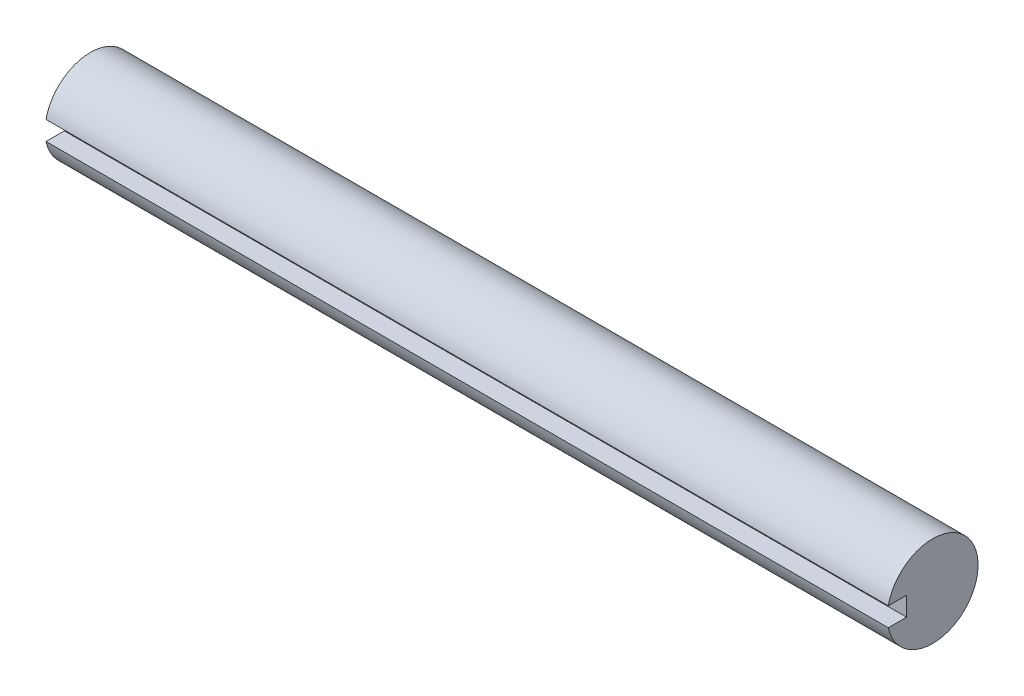
ISO-10303-21;
HEADER;
FILE_DESCRIPTION(('STEP AP214'),'2;1');
FILE_NAME('part.step','',(''),(''),'','','');
FILE_SCHEMA(('AUTOMOTIVE_DESIGN { 1 0 10303 214 1 1 1 1 }'));
ENDSEC;
DATA;
#1=APPLICATION_CONTEXT('core data for automotive mechanical design processes');
#2=APPLICATION_PROTOCOL_DEFINITION('international standard','automotive_design',2000,#1);
#3=PRODUCT_CONTEXT('',#1,'mechanical');
#4=PRODUCT('Part','Part','',(#3));
#5=PRODUCT_RELATED_PRODUCT_CATEGORY('part','',(#4));
#6=PRODUCT_DEFINITION_FORMATION('','',#4);
#7=PRODUCT_DEFINITION_CONTEXT('part definition',#1,'design');
#8=PRODUCT_DEFINITION('design','',#6,#7);
#9=PRODUCT_DEFINITION_SHAPE('','',#8);
#10=(LENGTH_UNIT() NAMED_UNIT(*) SI_UNIT(.MILLI.,.METRE.));
#11=(NAMED_UNIT(*) PLANE_ANGLE_UNIT() SI_UNIT($,.RADIAN.));
#12=(NAMED_UNIT(*) SI_UNIT($,.STERADIAN.) SOLID_ANGLE_UNIT());
#13=UNCERTAINTY_MEASURE_WITH_UNIT(LENGTH_MEASURE(1.E-05),#10,'distance_accuracy_value','');
#14=(GEOMETRIC_REPRESENTATION_CONTEXT(3) GLOBAL_UNCERTAINTY_ASSIGNED_CONTEXT((#13)) GLOBAL_UNIT_ASSIGNED_CONTEXT((#10,
#11,#12)) REPRESENTATION_CONTEXT('',''));
#15=CARTESIAN_POINT('',(0.,0.,0.));
#16=DIRECTION('',(0.,0.,1.));
#17=DIRECTION('',(1.,0.,0.));
#18=AXIS2_PLACEMENT_3D('',#15,#16,#17);
#19=CARTESIAN_POINT('',(230.,0.,0.));
#20=DIRECTION('',(-1.,0.,0.));
#21=DIRECTION('',(0.,0.,1.));
#22=AXIS2_PLACEMENT_3D('',#19,#20,#21);
#23=CYLINDRICAL_SURFACE('',#22,12.4);
#24=CARTESIAN_POINT('',(230.,0.,0.));
#25=DIRECTION('',(1.,0.,0.));
#26=DIRECTION('',(0.,0.,-1.));
#27=AXIS2_PLACEMENT_3D('',#24,#25,#26);
#28=CIRCLE('',#27,12.4);
#29=CARTESIAN_POINT('',(230.,-2.60000000000001,12.1243556529821));
#30=VERTEX_POINT('',#29);
#31=CARTESIAN_POINT('',(230.,2.59999999999999,12.1243556529821));
#32=VERTEX_POINT('',#31);
#33=EDGE_CURVE('E12',#30,#32,#28,.T.);
#34=ORIENTED_EDGE('',*,*,#33,.F.);
#35=DIRECTION('',(-1.,0.,0.));
#36=VECTOR('',#35,1.);
#37=CARTESIAN_POINT('',(230.,-2.60000000000001,12.1243556529821));
#38=LINE('',#37,#36);
#39=CARTESIAN_POINT('',(0.,-2.60000000000001,12.1243556529821));
#40=VERTEX_POINT('',#39);
#41=EDGE_CURVE('E94',#30,#40,#38,.T.);
#42=ORIENTED_EDGE('',*,*,#41,.T.);
#43=CARTESIAN_POINT('',(0.,0.,0.));
#44=DIRECTION('',(1.,0.,0.));
#45=DIRECTION('',(0.,0.,-1.));
#46=AXIS2_PLACEMENT_3D('',#43,#44,#45);
#47=CIRCLE('',#46,12.4);
#48=CARTESIAN_POINT('',(0.,2.59999999999999,12.1243556529821));
#49=VERTEX_POINT('',#48);
#50=EDGE_CURVE('E57',#40,#49,#47,.T.);
#51=ORIENTED_EDGE('',*,*,#50,.T.);
#52=DIRECTION('',(-1.,0.,0.));
#53=VECTOR('',#52,1.);
#54=CARTESIAN_POINT('',(230.,2.59999999999999,12.1243556529821));
#55=LINE('',#54,#53);
#56=EDGE_CURVE('E68',#32,#49,#55,.T.);
#57=ORIENTED_EDGE('',*,*,#56,.F.);
#58=EDGE_LOOP('',(#34,#42,#51,#57));
#59=FACE_BOUND('',#58,.T.);
#60=ADVANCED_FACE('F54',(#59),#23,.T.);
#61=CARTESIAN_POINT('',(230.,0.,0.));
#62=DIRECTION('',(1.,0.,0.));
#63=DIRECTION('',(0.,0.,-1.));
#64=AXIS2_PLACEMENT_3D('',#61,#62,#63);
#65=PLANE('',#64);
#66=DIRECTION('',(0.,0.,1.));
#67=VECTOR('',#66,1.);
#68=CARTESIAN_POINT('',(230.,-2.6,7.12435565298214));
#69=LINE('',#68,#67);
#70=CARTESIAN_POINT('',(230.,-2.6,7.12435565298214));
#71=VERTEX_POINT('',#70);
#72=EDGE_CURVE('E104',#71,#30,#69,.T.);
#73=ORIENTED_EDGE('',*,*,#72,.T.);
#74=ORIENTED_EDGE('',*,*,#33,.T.);
#75=DIRECTION('',(0.,0.,1.));
#76=VECTOR('',#75,1.);
#77=CARTESIAN_POINT('',(230.,2.6,7.12435565298214));
#78=LINE('',#77,#76);
#79=CARTESIAN_POINT('',(230.,2.6,7.12435565298214));
#80=VERTEX_POINT('',#79);
#81=EDGE_CURVE('E98',#80,#32,#78,.T.);
#82=ORIENTED_EDGE('',*,*,#81,.F.);
#83=DIRECTION('',(0.,1.,0.));
#84=VECTOR('',#83,1.);
#85=CARTESIAN_POINT('',(230.,-2.6,7.12435565298214));
#86=LINE('',#85,#84);
#87=EDGE_CURVE('E103',#71,#80,#86,.T.);
#88=ORIENTED_EDGE('',*,*,#87,.F.);
#89=EDGE_LOOP('',(#73,#74,#82,#88));
#90=FACE_BOUND('',#89,.T.);
#91=ADVANCED_FACE('F111',(#90),#65,.T.);
#92=CARTESIAN_POINT('',(0.,0.,0.));
#93=DIRECTION('',(1.,0.,0.));
#94=DIRECTION('',(0.,0.,-1.));
#95=AXIS2_PLACEMENT_3D('',#92,#93,#94);
#96=PLANE('',#95);
#97=ORIENTED_EDGE('',*,*,#50,.F.);
#98=DIRECTION('',(0.,0.,1.));
#99=VECTOR('',#98,1.);
#100=CARTESIAN_POINT('',(0.,-2.6,7.12435565298214));
#101=LINE('',#100,#99);
#102=CARTESIAN_POINT('',(0.,-2.6,7.12435565298214));
#103=VERTEX_POINT('',#102);
#104=EDGE_CURVE('E119',#103,#40,#101,.T.);
#105=ORIENTED_EDGE('',*,*,#104,.F.);
#106=DIRECTION('',(0.,1.,0.));
#107=VECTOR('',#106,1.);
#108=CARTESIAN_POINT('',(0.,-2.6,7.12435565298214));
#109=LINE('',#108,#107);
#110=CARTESIAN_POINT('',(0.,2.6,7.12435565298214));
#111=VERTEX_POINT('',#110);
#112=EDGE_CURVE('E112',#103,#111,#109,.T.);
#113=ORIENTED_EDGE('',*,*,#112,.T.);
#114=DIRECTION('',(0.,0.,1.));
#115=VECTOR('',#114,1.);
#116=CARTESIAN_POINT('',(0.,2.6,7.12435565298214));
#117=LINE('',#116,#115);
#118=EDGE_CURVE('E115',#111,#49,#117,.T.);
#119=ORIENTED_EDGE('',*,*,#118,.T.);
#120=EDGE_LOOP('',(#97,#105,#113,#119));
#121=FACE_BOUND('',#120,.T.);
#122=ADVANCED_FACE('F126',(#121),#96,.F.);
#123=CARTESIAN_POINT('',(230.,-2.6,7.12435565298214));
#124=DIRECTION('',(0.,-1.,0.));
#125=DIRECTION('',(0.,0.,-1.));
#126=AXIS2_PLACEMENT_3D('',#123,#124,#125);
#127=PLANE('',#126);
#128=ORIENTED_EDGE('',*,*,#104,.T.);
#129=ORIENTED_EDGE('',*,*,#41,.F.);
#130=ORIENTED_EDGE('',*,*,#72,.F.);
#131=DIRECTION('',(-1.,0.,0.));
#132=VECTOR('',#131,1.);
#133=CARTESIAN_POINT('',(230.,-2.6,7.12435565298214));
#134=LINE('',#133,#132);
#135=EDGE_CURVE('E77',#71,#103,#134,.T.);
#136=ORIENTED_EDGE('',*,*,#135,.T.);
#137=EDGE_LOOP('',(#128,#129,#130,#136));
#138=FACE_BOUND('',#137,.T.);
#139=ADVANCED_FACE('F129',(#138),#127,.F.);
#140=CARTESIAN_POINT('',(230.,-2.6,7.12435565298214));
#141=DIRECTION('',(0.,0.,1.));
#142=DIRECTION('',(1.,0.,0.));
#143=AXIS2_PLACEMENT_3D('',#140,#141,#142);
#144=PLANE('',#143);
#145=ORIENTED_EDGE('',*,*,#112,.F.);
#146=ORIENTED_EDGE('',*,*,#135,.F.);
#147=ORIENTED_EDGE('',*,*,#87,.T.);
#148=DIRECTION('',(-1.,0.,0.));
#149=VECTOR('',#148,1.);
#150=CARTESIAN_POINT('',(230.,2.6,7.12435565298214));
#151=LINE('',#150,#149);
#152=EDGE_CURVE('E100',#80,#111,#151,.T.);
#153=ORIENTED_EDGE('',*,*,#152,.T.);
#154=EDGE_LOOP('',(#145,#146,#147,#153));
#155=FACE_BOUND('',#154,.T.);
#156=ADVANCED_FACE('F127',(#155),#144,.T.);
#157=CARTESIAN_POINT('',(230.,2.6,7.12435565298214));
#158=DIRECTION('',(0.,-1.,0.));
#159=DIRECTION('',(0.,0.,-1.));
#160=AXIS2_PLACEMENT_3D('',#157,#158,#159);
#161=PLANE('',#160);
#162=ORIENTED_EDGE('',*,*,#118,.F.);
#163=ORIENTED_EDGE('',*,*,#152,.F.);
#164=ORIENTED_EDGE('',*,*,#81,.T.);
#165=ORIENTED_EDGE('',*,*,#56,.T.);
#166=EDGE_LOOP('',(#162,#163,#164,#165));
#167=FACE_BOUND('',#166,.T.);
#168=ADVANCED_FACE('F99',(#167),#161,.T.);
#169=CLOSED_SHELL('',(#60,#91,#122,#139,#156,#168));
#170=MANIFOLD_SOLID_BREP('B2',#169);
#171=ADVANCED_BREP_SHAPE_REPRESENTATION('',(#18,#170),#14);
#172=SHAPE_DEFINITION_REPRESENTATION(#9,#171);
ENDSEC;
END-ISO-10303-21;
